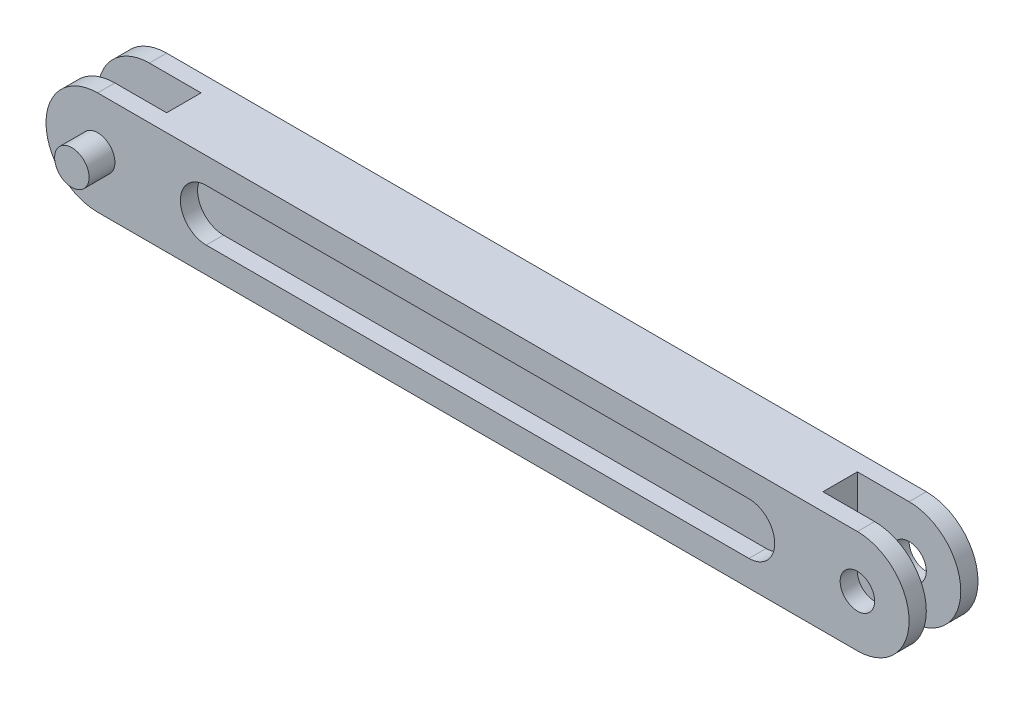
ISO-10303-21;
HEADER;
FILE_DESCRIPTION(('STEP AP214'),'2;1');
FILE_NAME('part.step','',(''),(''),'','','');
FILE_SCHEMA(('AUTOMOTIVE_DESIGN { 1 0 10303 214 1 1 1 1 }'));
ENDSEC;
DATA;
#1=APPLICATION_CONTEXT('core data for automotive mechanical design processes');
#2=APPLICATION_PROTOCOL_DEFINITION('international standard','automotive_design',2000,#1);
#3=PRODUCT_CONTEXT('',#1,'mechanical');
#4=PRODUCT('Part','Part','',(#3));
#5=PRODUCT_RELATED_PRODUCT_CATEGORY('part','',(#4));
#6=PRODUCT_DEFINITION_FORMATION('','',#4);
#7=PRODUCT_DEFINITION_CONTEXT('part definition',#1,'design');
#8=PRODUCT_DEFINITION('design','',#6,#7);
#9=PRODUCT_DEFINITION_SHAPE('','',#8);
#10=(LENGTH_UNIT() NAMED_UNIT(*) SI_UNIT(.MILLI.,.METRE.));
#11=(NAMED_UNIT(*) PLANE_ANGLE_UNIT() SI_UNIT($,.RADIAN.));
#12=(NAMED_UNIT(*) SI_UNIT($,.STERADIAN.) SOLID_ANGLE_UNIT());
#13=UNCERTAINTY_MEASURE_WITH_UNIT(LENGTH_MEASURE(1.E-05),#10,'distance_accuracy_value','');
#14=(GEOMETRIC_REPRESENTATION_CONTEXT(3) GLOBAL_UNCERTAINTY_ASSIGNED_CONTEXT((#13)) GLOBAL_UNIT_ASSIGNED_CONTEXT((#10,
#11,#12)) REPRESENTATION_CONTEXT('',''));
#15=CARTESIAN_POINT('',(0.,0.,0.));
#16=DIRECTION('',(0.,0.,1.));
#17=DIRECTION('',(1.,0.,0.));
#18=AXIS2_PLACEMENT_3D('',#15,#16,#17);
#19=CARTESIAN_POINT('',(0.,-19.05,25.4));
#20=DIRECTION('',(0.,1.,0.));
#21=DIRECTION('',(0.,0.,1.));
#22=AXIS2_PLACEMENT_3D('',#19,#20,#21);
#23=PLANE('',#22);
#24=DIRECTION('',(1.,0.,0.));
#25=VECTOR('',#24,1.);
#26=CARTESIAN_POINT('',(260.95,-19.05,19.05));
#27=LINE('',#26,#25);
#28=CARTESIAN_POINT('',(260.95,-19.05,19.05));
#29=VERTEX_POINT('',#28);
#30=CARTESIAN_POINT('',(280.,-19.05,19.05));
#31=VERTEX_POINT('',#30);
#32=EDGE_CURVE('E329',#29,#31,#27,.T.);
#33=ORIENTED_EDGE('',*,*,#32,.T.);
#34=DIRECTION('',(0.,0.,-1.));
#35=VECTOR('',#34,1.);
#36=CARTESIAN_POINT('',(280.,-19.05,25.4));
#37=LINE('',#36,#35);
#38=CARTESIAN_POINT('',(280.,-19.05,25.4));
#39=VERTEX_POINT('',#38);
#40=EDGE_CURVE('E326',#39,#31,#37,.T.);
#41=ORIENTED_EDGE('',*,*,#40,.F.);
#42=DIRECTION('',(1.,0.,0.));
#43=VECTOR('',#42,1.);
#44=CARTESIAN_POINT('',(0.,-19.05,25.4));
#45=LINE('',#44,#43);
#46=CARTESIAN_POINT('',(0.,-19.05,25.4));
#47=VERTEX_POINT('',#46);
#48=EDGE_CURVE('E302',#47,#39,#45,.T.);
#49=ORIENTED_EDGE('',*,*,#48,.F.);
#50=DIRECTION('',(0.,0.,-1.));
#51=VECTOR('',#50,1.);
#52=CARTESIAN_POINT('',(0.,-19.05,25.4));
#53=LINE('',#52,#51);
#54=CARTESIAN_POINT('',(0.,-19.05,19.05));
#55=VERTEX_POINT('',#54);
#56=EDGE_CURVE('E11',#47,#55,#53,.T.);
#57=ORIENTED_EDGE('',*,*,#56,.T.);
#58=DIRECTION('',(-1.,0.,0.));
#59=VECTOR('',#58,1.);
#60=CARTESIAN_POINT('',(19.05,-19.05,19.05));
#61=LINE('',#60,#59);
#62=CARTESIAN_POINT('',(19.05,-19.05,19.05));
#63=VERTEX_POINT('',#62);
#64=EDGE_CURVE('E210',#63,#55,#61,.T.);
#65=ORIENTED_EDGE('',*,*,#64,.F.);
#66=DIRECTION('',(0.,0.,1.));
#67=VECTOR('',#66,1.);
#68=CARTESIAN_POINT('',(19.05,-19.05,6.35));
#69=LINE('',#68,#67);
#70=CARTESIAN_POINT('',(19.05,-19.05,6.35));
#71=VERTEX_POINT('',#70);
#72=EDGE_CURVE('E202',#71,#63,#69,.T.);
#73=ORIENTED_EDGE('',*,*,#72,.F.);
#74=DIRECTION('',(-1.,0.,0.));
#75=VECTOR('',#74,1.);
#76=CARTESIAN_POINT('',(19.05,-19.05,6.35));
#77=LINE('',#76,#75);
#78=CARTESIAN_POINT('',(0.,-19.05,6.35));
#79=VERTEX_POINT('',#78);
#80=EDGE_CURVE('E211',#71,#79,#77,.T.);
#81=ORIENTED_EDGE('',*,*,#80,.T.);
#82=CARTESIAN_POINT('',(0.,-19.05,0.));
#83=VERTEX_POINT('',#82);
#84=EDGE_CURVE('E41',#79,#83,#53,.T.);
#85=ORIENTED_EDGE('',*,*,#84,.T.);
#86=DIRECTION('',(1.,0.,0.));
#87=VECTOR('',#86,1.);
#88=CARTESIAN_POINT('',(0.,-19.05,0.));
#89=LINE('',#88,#87);
#90=CARTESIAN_POINT('',(280.,-19.05,0.));
#91=VERTEX_POINT('',#90);
#92=EDGE_CURVE('E312',#83,#91,#89,.T.);
#93=ORIENTED_EDGE('',*,*,#92,.T.);
#94=CARTESIAN_POINT('',(280.,-19.05,6.35));
#95=VERTEX_POINT('',#94);
#96=EDGE_CURVE('E190',#95,#91,#37,.T.);
#97=ORIENTED_EDGE('',*,*,#96,.F.);
#98=DIRECTION('',(1.,0.,0.));
#99=VECTOR('',#98,1.);
#100=CARTESIAN_POINT('',(260.95,-19.05,6.35));
#101=LINE('',#100,#99);
#102=CARTESIAN_POINT('',(260.95,-19.05,6.35));
#103=VERTEX_POINT('',#102);
#104=EDGE_CURVE('E172',#103,#95,#101,.T.);
#105=ORIENTED_EDGE('',*,*,#104,.F.);
#106=DIRECTION('',(0.,0.,1.));
#107=VECTOR('',#106,1.);
#108=CARTESIAN_POINT('',(260.95,-19.05,6.35));
#109=LINE('',#108,#107);
#110=EDGE_CURVE('E178',#103,#29,#109,.T.);
#111=ORIENTED_EDGE('',*,*,#110,.T.);
#112=EDGE_LOOP('',(#33,#41,#49,#57,#65,#73,#81,#85,#93,#97,#105,#111));
#113=FACE_BOUND('',#112,.T.);
#114=ADVANCED_FACE('F32',(#113),#23,.F.);
#115=CARTESIAN_POINT('',(280.,0.,25.4));
#116=DIRECTION('',(0.,0.,-1.));
#117=DIRECTION('',(-1.,0.,0.));
#118=AXIS2_PLACEMENT_3D('',#115,#116,#117);
#119=CYLINDRICAL_SURFACE('',#118,19.05);
#120=CARTESIAN_POINT('',(280.,0.,19.05));
#121=DIRECTION('',(0.,0.,-1.));
#122=DIRECTION('',(-1.,0.,0.));
#123=AXIS2_PLACEMENT_3D('',#120,#121,#122);
#124=CIRCLE('',#123,19.05);
#125=CARTESIAN_POINT('',(280.,19.05,19.05));
#126=VERTEX_POINT('',#125);
#127=EDGE_CURVE('E200',#126,#31,#124,.T.);
#128=ORIENTED_EDGE('',*,*,#127,.F.);
#129=DIRECTION('',(0.,0.,-1.));
#130=VECTOR('',#129,1.);
#131=CARTESIAN_POINT('',(280.,19.05,25.4));
#132=LINE('',#131,#130);
#133=CARTESIAN_POINT('',(280.,19.05,25.4));
#134=VERTEX_POINT('',#133);
#135=EDGE_CURVE('E323',#134,#126,#132,.T.);
#136=ORIENTED_EDGE('',*,*,#135,.F.);
#137=CARTESIAN_POINT('',(280.,0.,25.4));
#138=DIRECTION('',(0.,0.,1.));
#139=DIRECTION('',(1.,0.,0.));
#140=AXIS2_PLACEMENT_3D('',#137,#138,#139);
#141=CIRCLE('',#140,19.05);
#142=EDGE_CURVE('E305',#39,#134,#141,.T.);
#143=ORIENTED_EDGE('',*,*,#142,.F.);
#144=ORIENTED_EDGE('',*,*,#40,.T.);
#145=EDGE_LOOP('',(#128,#136,#143,#144));
#146=FACE_BOUND('',#145,.T.);
#147=ADVANCED_FACE('F371',(#146),#119,.T.);
#148=CARTESIAN_POINT('',(280.,0.,6.35));
#149=DIRECTION('',(0.,0.,1.));
#150=DIRECTION('',(0.,-1.,0.));
#151=AXIS2_PLACEMENT_3D('',#148,#149,#150);
#152=CIRCLE('',#151,19.05);
#153=CARTESIAN_POINT('',(280.,19.05,6.35));
#154=VERTEX_POINT('',#153);
#155=EDGE_CURVE('E197',#95,#154,#152,.T.);
#156=ORIENTED_EDGE('',*,*,#155,.F.);
#157=ORIENTED_EDGE('',*,*,#96,.T.);
#158=CARTESIAN_POINT('',(280.,0.,0.));
#159=DIRECTION('',(0.,0.,1.));
#160=DIRECTION('',(1.,0.,0.));
#161=AXIS2_PLACEMENT_3D('',#158,#159,#160);
#162=CIRCLE('',#161,19.05);
#163=CARTESIAN_POINT('',(280.,19.05,0.));
#164=VERTEX_POINT('',#163);
#165=EDGE_CURVE('E314',#91,#164,#162,.T.);
#166=ORIENTED_EDGE('',*,*,#165,.T.);
#167=EDGE_CURVE('E322',#154,#164,#132,.T.);
#168=ORIENTED_EDGE('',*,*,#167,.F.);
#169=EDGE_LOOP('',(#156,#157,#166,#168));
#170=FACE_BOUND('',#169,.T.);
#171=ADVANCED_FACE('F375',(#170),#119,.T.);
#172=CARTESIAN_POINT('',(0.,19.05,25.4));
#173=DIRECTION('',(0.,-1.,0.));
#174=DIRECTION('',(0.,0.,-1.));
#175=AXIS2_PLACEMENT_3D('',#172,#173,#174);
#176=PLANE('',#175);
#177=DIRECTION('',(1.,0.,0.));
#178=VECTOR('',#177,1.);
#179=CARTESIAN_POINT('',(260.95,19.05,19.05));
#180=LINE('',#179,#178);
#181=CARTESIAN_POINT('',(260.95,19.05,19.05));
#182=VERTEX_POINT('',#181);
#183=EDGE_CURVE('E192',#182,#126,#180,.T.);
#184=ORIENTED_EDGE('',*,*,#183,.F.);
#185=DIRECTION('',(0.,0.,-1.));
#186=VECTOR('',#185,1.);
#187=CARTESIAN_POINT('',(260.95,19.05,6.35));
#188=LINE('',#187,#186);
#189=CARTESIAN_POINT('',(260.95,19.05,6.35));
#190=VERTEX_POINT('',#189);
#191=EDGE_CURVE('E177',#182,#190,#188,.T.);
#192=ORIENTED_EDGE('',*,*,#191,.T.);
#193=DIRECTION('',(1.,0.,0.));
#194=VECTOR('',#193,1.);
#195=CARTESIAN_POINT('',(260.95,19.05,6.35));
#196=LINE('',#195,#194);
#197=EDGE_CURVE('E175',#190,#154,#196,.T.);
#198=ORIENTED_EDGE('',*,*,#197,.T.);
#199=ORIENTED_EDGE('',*,*,#167,.T.);
#200=DIRECTION('',(-1.,0.,0.));
#201=VECTOR('',#200,1.);
#202=CARTESIAN_POINT('',(0.,19.05,0.));
#203=LINE('',#202,#201);
#204=CARTESIAN_POINT('',(0.,19.05,0.));
#205=VERTEX_POINT('',#204);
#206=EDGE_CURVE('E303',#164,#205,#203,.T.);
#207=ORIENTED_EDGE('',*,*,#206,.T.);
#208=DIRECTION('',(0.,0.,-1.));
#209=VECTOR('',#208,1.);
#210=CARTESIAN_POINT('',(0.,19.05,25.4));
#211=LINE('',#210,#209);
#212=CARTESIAN_POINT('',(0.,19.05,6.35));
#213=VERTEX_POINT('',#212);
#214=EDGE_CURVE('E309',#213,#205,#211,.T.);
#215=ORIENTED_EDGE('',*,*,#214,.F.);
#216=DIRECTION('',(-1.,0.,0.));
#217=VECTOR('',#216,1.);
#218=CARTESIAN_POINT('',(19.05,19.05,6.35));
#219=LINE('',#218,#217);
#220=CARTESIAN_POINT('',(19.05,19.05,6.35));
#221=VERTEX_POINT('',#220);
#222=EDGE_CURVE('E215',#221,#213,#219,.T.);
#223=ORIENTED_EDGE('',*,*,#222,.F.);
#224=DIRECTION('',(0.,0.,-1.));
#225=VECTOR('',#224,1.);
#226=CARTESIAN_POINT('',(19.05,19.05,6.35));
#227=LINE('',#226,#225);
#228=CARTESIAN_POINT('',(19.05,19.05,19.05));
#229=VERTEX_POINT('',#228);
#230=EDGE_CURVE('E205',#229,#221,#227,.T.);
#231=ORIENTED_EDGE('',*,*,#230,.F.);
#232=DIRECTION('',(-1.,0.,0.));
#233=VECTOR('',#232,1.);
#234=CARTESIAN_POINT('',(19.05,19.05,19.05));
#235=LINE('',#234,#233);
#236=CARTESIAN_POINT('',(0.,19.05,19.05));
#237=VERTEX_POINT('',#236);
#238=EDGE_CURVE('E218',#229,#237,#235,.T.);
#239=ORIENTED_EDGE('',*,*,#238,.T.);
#240=CARTESIAN_POINT('',(0.,19.05,25.4));
#241=VERTEX_POINT('',#240);
#242=EDGE_CURVE('E319',#241,#237,#211,.T.);
#243=ORIENTED_EDGE('',*,*,#242,.F.);
#244=DIRECTION('',(-1.,0.,0.));
#245=VECTOR('',#244,1.);
#246=CARTESIAN_POINT('',(0.,19.05,25.4));
#247=LINE('',#246,#245);
#248=EDGE_CURVE('E307',#134,#241,#247,.T.);
#249=ORIENTED_EDGE('',*,*,#248,.F.);
#250=ORIENTED_EDGE('',*,*,#135,.T.);
#251=EDGE_LOOP('',(#184,#192,#198,#199,#207,#215,#223,#231,#239,#243,#249,#250));
#252=FACE_BOUND('',#251,.T.);
#253=ADVANCED_FACE('F379',(#252),#176,.F.);
#254=CARTESIAN_POINT('',(280.,0.,25.4));
#255=DIRECTION('',(0.,0.,-1.));
#256=DIRECTION('',(-1.,0.,0.));
#257=AXIS2_PLACEMENT_3D('',#254,#255,#256);
#258=CYLINDRICAL_SURFACE('',#257,6.35);
#259=CARTESIAN_POINT('',(280.,0.,25.4));
#260=DIRECTION('',(0.,0.,1.));
#261=DIRECTION('',(1.,0.,0.));
#262=AXIS2_PLACEMENT_3D('',#259,#260,#261);
#263=CIRCLE('',#262,6.35);
#264=CARTESIAN_POINT('',(286.35,0.,25.4));
#265=VERTEX_POINT('',#264);
#266=EDGE_CURVE('E290',#265,#265,#263,.T.);
#267=ORIENTED_EDGE('',*,*,#266,.T.);
#268=EDGE_LOOP('',(#267));
#269=FACE_BOUND('',#268,.T.);
#270=CARTESIAN_POINT('',(280.,0.,19.05));
#271=DIRECTION('',(0.,0.,-1.));
#272=DIRECTION('',(-1.,0.,0.));
#273=AXIS2_PLACEMENT_3D('',#270,#271,#272);
#274=CIRCLE('',#273,6.35);
#275=CARTESIAN_POINT('',(273.65,0.,19.05));
#276=VERTEX_POINT('',#275);
#277=EDGE_CURVE('E36',#276,#276,#274,.T.);
#278=ORIENTED_EDGE('',*,*,#277,.T.);
#279=EDGE_LOOP('',(#278));
#280=FACE_BOUND('',#279,.T.);
#281=ADVANCED_FACE('F382',(#269,#280),#258,.F.);
#282=CARTESIAN_POINT('',(280.,0.,0.));
#283=DIRECTION('',(0.,0.,1.));
#284=DIRECTION('',(1.,0.,0.));
#285=AXIS2_PLACEMENT_3D('',#282,#283,#284);
#286=CIRCLE('',#285,6.35);
#287=CARTESIAN_POINT('',(286.35,0.,0.));
#288=VERTEX_POINT('',#287);
#289=EDGE_CURVE('E283',#288,#288,#286,.T.);
#290=ORIENTED_EDGE('',*,*,#289,.F.);
#291=EDGE_LOOP('',(#290));
#292=FACE_BOUND('',#291,.T.);
#293=CARTESIAN_POINT('',(280.,0.,6.35));
#294=DIRECTION('',(0.,0.,1.));
#295=DIRECTION('',(0.,-1.,0.));
#296=AXIS2_PLACEMENT_3D('',#293,#294,#295);
#297=CIRCLE('',#296,6.35);
#298=CARTESIAN_POINT('',(280.,-6.35,6.35));
#299=VERTEX_POINT('',#298);
#300=EDGE_CURVE('E199',#299,#299,#297,.T.);
#301=ORIENTED_EDGE('',*,*,#300,.T.);
#302=EDGE_LOOP('',(#301));
#303=FACE_BOUND('',#302,.T.);
#304=ADVANCED_FACE('F395',(#292,#303),#258,.F.);
#305=CARTESIAN_POINT('',(0.,0.,25.4));
#306=DIRECTION('',(0.,0.,-1.));
#307=DIRECTION('',(-1.,0.,0.));
#308=AXIS2_PLACEMENT_3D('',#305,#306,#307);
#309=CYLINDRICAL_SURFACE('',#308,19.05);
#310=ORIENTED_EDGE('',*,*,#242,.T.);
#311=CARTESIAN_POINT('',(0.,0.,19.05));
#312=DIRECTION('',(0.,0.,1.));
#313=DIRECTION('',(1.,0.,0.));
#314=AXIS2_PLACEMENT_3D('',#311,#312,#313);
#315=CIRCLE('',#314,19.05);
#316=EDGE_CURVE('E214',#237,#55,#315,.T.);
#317=ORIENTED_EDGE('',*,*,#316,.T.);
#318=ORIENTED_EDGE('',*,*,#56,.F.);
#319=CARTESIAN_POINT('',(0.,0.,25.4));
#320=DIRECTION('',(0.,0.,1.));
#321=DIRECTION('',(1.,0.,0.));
#322=AXIS2_PLACEMENT_3D('',#319,#320,#321);
#323=CIRCLE('',#322,19.05);
#324=EDGE_CURVE('E299',#241,#47,#323,.T.);
#325=ORIENTED_EDGE('',*,*,#324,.F.);
#326=EDGE_LOOP('',(#310,#317,#318,#325));
#327=FACE_BOUND('',#326,.T.);
#328=ADVANCED_FACE('F388',(#327),#309,.T.);
#329=CARTESIAN_POINT('',(0.,0.,0.));
#330=DIRECTION('',(0.,0.,1.));
#331=DIRECTION('',(1.,0.,0.));
#332=AXIS2_PLACEMENT_3D('',#329,#330,#331);
#333=PLANE('',#332);
#334=ORIENTED_EDGE('',*,*,#289,.T.);
#335=EDGE_LOOP('',(#334));
#336=FACE_BOUND('',#335,.T.);
#337=CARTESIAN_POINT('',(0.,0.,0.));
#338=DIRECTION('',(0.,0.,1.));
#339=DIRECTION('',(1.,0.,0.));
#340=AXIS2_PLACEMENT_3D('',#337,#338,#339);
#341=CIRCLE('',#340,6.35);
#342=CARTESIAN_POINT('',(6.35,0.,0.));
#343=VERTEX_POINT('',#342);
#344=EDGE_CURVE('E186',#343,#343,#341,.T.);
#345=ORIENTED_EDGE('',*,*,#344,.T.);
#346=EDGE_LOOP('',(#345));
#347=FACE_BOUND('',#346,.T.);
#348=CARTESIAN_POINT('',(0.,0.,0.));
#349=DIRECTION('',(0.,0.,1.));
#350=DIRECTION('',(1.,0.,0.));
#351=AXIS2_PLACEMENT_3D('',#348,#349,#350);
#352=CIRCLE('',#351,19.05);
#353=EDGE_CURVE('E298',#205,#83,#352,.T.);
#354=ORIENTED_EDGE('',*,*,#353,.F.);
#355=ORIENTED_EDGE('',*,*,#206,.F.);
#356=ORIENTED_EDGE('',*,*,#165,.F.);
#357=ORIENTED_EDGE('',*,*,#92,.F.);
#358=EDGE_LOOP('',(#354,#355,#356,#357));
#359=FACE_BOUND('',#358,.T.);
#360=CARTESIAN_POINT('',(40.,0.,0.));
#361=DIRECTION('',(0.,0.,1.));
#362=DIRECTION('',(1.,0.,0.));
#363=AXIS2_PLACEMENT_3D('',#360,#361,#362);
#364=CIRCLE('',#363,9.525);
#365=CARTESIAN_POINT('',(40.,9.525,0.));
#366=VERTEX_POINT('',#365);
#367=CARTESIAN_POINT('',(40.,-9.525,0.));
#368=VERTEX_POINT('',#367);
#369=EDGE_CURVE('E226',#366,#368,#364,.T.);
#370=ORIENTED_EDGE('',*,*,#369,.T.);
#371=DIRECTION('',(1.,0.,0.));
#372=VECTOR('',#371,1.);
#373=CARTESIAN_POINT('',(40.,-9.525,0.));
#374=LINE('',#373,#372);
#375=CARTESIAN_POINT('',(240.,-9.525,0.));
#376=VERTEX_POINT('',#375);
#377=EDGE_CURVE('E231',#368,#376,#374,.T.);
#378=ORIENTED_EDGE('',*,*,#377,.T.);
#379=CARTESIAN_POINT('',(240.,0.,0.));
#380=DIRECTION('',(0.,0.,1.));
#381=DIRECTION('',(1.,0.,0.));
#382=AXIS2_PLACEMENT_3D('',#379,#380,#381);
#383=CIRCLE('',#382,9.525);
#384=CARTESIAN_POINT('',(240.,9.525,0.));
#385=VERTEX_POINT('',#384);
#386=EDGE_CURVE('E243',#376,#385,#383,.T.);
#387=ORIENTED_EDGE('',*,*,#386,.T.);
#388=DIRECTION('',(-1.,0.,0.));
#389=VECTOR('',#388,1.);
#390=CARTESIAN_POINT('',(40.,9.525,0.));
#391=LINE('',#390,#389);
#392=EDGE_CURVE('E240',#385,#366,#391,.T.);
#393=ORIENTED_EDGE('',*,*,#392,.T.);
#394=EDGE_LOOP('',(#370,#378,#387,#393));
#395=FACE_BOUND('',#394,.T.);
#396=ADVANCED_FACE('F384',(#336,#347,#359,#395),#333,.F.);
#397=CARTESIAN_POINT('',(0.,0.,25.4));
#398=DIRECTION('',(0.,0.,1.));
#399=DIRECTION('',(1.,0.,0.));
#400=AXIS2_PLACEMENT_3D('',#397,#398,#399);
#401=PLANE('',#400);
#402=CARTESIAN_POINT('',(40.,0.,25.4));
#403=DIRECTION('',(0.,0.,1.));
#404=DIRECTION('',(1.,0.,0.));
#405=AXIS2_PLACEMENT_3D('',#402,#403,#404);
#406=CIRCLE('',#405,9.525);
#407=CARTESIAN_POINT('',(40.,9.525,25.4));
#408=VERTEX_POINT('',#407);
#409=CARTESIAN_POINT('',(40.,-9.525,25.4));
#410=VERTEX_POINT('',#409);
#411=EDGE_CURVE('E251',#408,#410,#406,.T.);
#412=ORIENTED_EDGE('',*,*,#411,.F.);
#413=DIRECTION('',(-1.,0.,0.));
#414=VECTOR('',#413,1.);
#415=CARTESIAN_POINT('',(40.,9.525,25.4));
#416=LINE('',#415,#414);
#417=CARTESIAN_POINT('',(240.,9.525,25.4));
#418=VERTEX_POINT('',#417);
#419=EDGE_CURVE('E262',#418,#408,#416,.T.);
#420=ORIENTED_EDGE('',*,*,#419,.F.);
#421=CARTESIAN_POINT('',(240.,0.,25.4));
#422=DIRECTION('',(0.,0.,1.));
#423=DIRECTION('',(1.,0.,0.));
#424=AXIS2_PLACEMENT_3D('',#421,#422,#423);
#425=CIRCLE('',#424,9.525);
#426=CARTESIAN_POINT('',(240.,-9.525,25.4));
#427=VERTEX_POINT('',#426);
#428=EDGE_CURVE('E276',#427,#418,#425,.T.);
#429=ORIENTED_EDGE('',*,*,#428,.F.);
#430=DIRECTION('',(1.,0.,0.));
#431=VECTOR('',#430,1.);
#432=CARTESIAN_POINT('',(40.,-9.525,25.4));
#433=LINE('',#432,#431);
#434=EDGE_CURVE('E273',#410,#427,#433,.T.);
#435=ORIENTED_EDGE('',*,*,#434,.F.);
#436=EDGE_LOOP('',(#412,#420,#429,#435));
#437=FACE_BOUND('',#436,.T.);
#438=CARTESIAN_POINT('',(0.,0.,25.4));
#439=DIRECTION('',(0.,0.,1.));
#440=DIRECTION('',(1.,0.,0.));
#441=AXIS2_PLACEMENT_3D('',#438,#439,#440);
#442=CIRCLE('',#441,6.35);
#443=CARTESIAN_POINT('',(6.35,0.,25.4));
#444=VERTEX_POINT('',#443);
#445=EDGE_CURVE('E293',#444,#444,#442,.T.);
#446=ORIENTED_EDGE('',*,*,#445,.F.);
#447=EDGE_LOOP('',(#446));
#448=FACE_BOUND('',#447,.T.);
#449=ORIENTED_EDGE('',*,*,#324,.T.);
#450=ORIENTED_EDGE('',*,*,#48,.T.);
#451=ORIENTED_EDGE('',*,*,#142,.T.);
#452=ORIENTED_EDGE('',*,*,#248,.T.);
#453=EDGE_LOOP('',(#449,#450,#451,#452));
#454=FACE_BOUND('',#453,.T.);
#455=ORIENTED_EDGE('',*,*,#266,.F.);
#456=EDGE_LOOP('',(#455));
#457=FACE_BOUND('',#456,.T.);
#458=ADVANCED_FACE('F387',(#437,#448,#454,#457),#401,.T.);
#459=ORIENTED_EDGE('',*,*,#84,.F.);
#460=CARTESIAN_POINT('',(0.,0.,6.35));
#461=DIRECTION('',(0.,0.,-1.));
#462=DIRECTION('',(0.,1.,0.));
#463=AXIS2_PLACEMENT_3D('',#460,#461,#462);
#464=CIRCLE('',#463,19.05);
#465=EDGE_CURVE('E224',#79,#213,#464,.T.);
#466=ORIENTED_EDGE('',*,*,#465,.T.);
#467=ORIENTED_EDGE('',*,*,#214,.T.);
#468=ORIENTED_EDGE('',*,*,#353,.T.);
#469=EDGE_LOOP('',(#459,#466,#467,#468));
#470=FACE_BOUND('',#469,.T.);
#471=ADVANCED_FACE('F34',(#470),#309,.T.);
#472=CARTESIAN_POINT('',(40.,0.,19.05));
#473=DIRECTION('',(0.,0.,1.));
#474=DIRECTION('',(1.,0.,0.));
#475=AXIS2_PLACEMENT_3D('',#472,#473,#474);
#476=CYLINDRICAL_SURFACE('',#475,9.525);
#477=ORIENTED_EDGE('',*,*,#411,.T.);
#478=DIRECTION('',(0.,0.,1.));
#479=VECTOR('',#478,1.);
#480=CARTESIAN_POINT('',(40.,-9.525,19.05));
#481=LINE('',#480,#479);
#482=CARTESIAN_POINT('',(40.,-9.525,19.05));
#483=VERTEX_POINT('',#482);
#484=EDGE_CURVE('E271',#483,#410,#481,.T.);
#485=ORIENTED_EDGE('',*,*,#484,.F.);
#486=CARTESIAN_POINT('',(40.,0.,19.05));
#487=DIRECTION('',(0.,0.,1.));
#488=DIRECTION('',(1.,0.,0.));
#489=AXIS2_PLACEMENT_3D('',#486,#487,#488);
#490=CIRCLE('',#489,9.525);
#491=CARTESIAN_POINT('',(40.,9.525,19.05));
#492=VERTEX_POINT('',#491);
#493=EDGE_CURVE('E258',#492,#483,#490,.T.);
#494=ORIENTED_EDGE('',*,*,#493,.F.);
#495=DIRECTION('',(0.,0.,1.));
#496=VECTOR('',#495,1.);
#497=CARTESIAN_POINT('',(40.,9.525,19.05));
#498=LINE('',#497,#496);
#499=EDGE_CURVE('E281',#492,#408,#498,.T.);
#500=ORIENTED_EDGE('',*,*,#499,.T.);
#501=EDGE_LOOP('',(#477,#485,#494,#500));
#502=FACE_BOUND('',#501,.T.);
#503=ADVANCED_FACE('F397',(#502),#476,.F.);
#504=CARTESIAN_POINT('',(40.,9.525,19.05));
#505=DIRECTION('',(0.,1.,0.));
#506=DIRECTION('',(0.,0.,1.));
#507=AXIS2_PLACEMENT_3D('',#504,#505,#506);
#508=PLANE('',#507);
#509=ORIENTED_EDGE('',*,*,#419,.T.);
#510=ORIENTED_EDGE('',*,*,#499,.F.);
#511=DIRECTION('',(-1.,0.,0.));
#512=VECTOR('',#511,1.);
#513=CARTESIAN_POINT('',(40.,9.525,19.05));
#514=LINE('',#513,#512);
#515=CARTESIAN_POINT('',(240.,9.525,19.05));
#516=VERTEX_POINT('',#515);
#517=EDGE_CURVE('E268',#516,#492,#514,.T.);
#518=ORIENTED_EDGE('',*,*,#517,.F.);
#519=DIRECTION('',(0.,0.,1.));
#520=VECTOR('',#519,1.);
#521=CARTESIAN_POINT('',(240.,9.525,19.05));
#522=LINE('',#521,#520);
#523=EDGE_CURVE('E284',#516,#418,#522,.T.);
#524=ORIENTED_EDGE('',*,*,#523,.T.);
#525=EDGE_LOOP('',(#509,#510,#518,#524));
#526=FACE_BOUND('',#525,.T.);
#527=ADVANCED_FACE('F400',(#526),#508,.F.);
#528=CARTESIAN_POINT('',(240.,0.,19.05));
#529=DIRECTION('',(0.,0.,1.));
#530=DIRECTION('',(1.,0.,0.));
#531=AXIS2_PLACEMENT_3D('',#528,#529,#530);
#532=CYLINDRICAL_SURFACE('',#531,9.525);
#533=ORIENTED_EDGE('',*,*,#428,.T.);
#534=ORIENTED_EDGE('',*,*,#523,.F.);
#535=CARTESIAN_POINT('',(240.,0.,19.05));
#536=DIRECTION('',(0.,0.,1.));
#537=DIRECTION('',(1.,0.,0.));
#538=AXIS2_PLACEMENT_3D('',#535,#536,#537);
#539=CIRCLE('',#538,9.525);
#540=CARTESIAN_POINT('',(240.,-9.525,19.05));
#541=VERTEX_POINT('',#540);
#542=EDGE_CURVE('E265',#541,#516,#539,.T.);
#543=ORIENTED_EDGE('',*,*,#542,.F.);
#544=DIRECTION('',(0.,0.,1.));
#545=VECTOR('',#544,1.);
#546=CARTESIAN_POINT('',(240.,-9.525,19.05));
#547=LINE('',#546,#545);
#548=EDGE_CURVE('E286',#541,#427,#547,.T.);
#549=ORIENTED_EDGE('',*,*,#548,.T.);
#550=EDGE_LOOP('',(#533,#534,#543,#549));
#551=FACE_BOUND('',#550,.T.);
#552=ADVANCED_FACE('F406',(#551),#532,.F.);
#553=CARTESIAN_POINT('',(40.,-9.525,19.05));
#554=DIRECTION('',(0.,-1.,0.));
#555=DIRECTION('',(0.,0.,-1.));
#556=AXIS2_PLACEMENT_3D('',#553,#554,#555);
#557=PLANE('',#556);
#558=ORIENTED_EDGE('',*,*,#434,.T.);
#559=ORIENTED_EDGE('',*,*,#548,.F.);
#560=DIRECTION('',(1.,0.,0.));
#561=VECTOR('',#560,1.);
#562=CARTESIAN_POINT('',(40.,-9.525,19.05));
#563=LINE('',#562,#561);
#564=EDGE_CURVE('E261',#483,#541,#563,.T.);
#565=ORIENTED_EDGE('',*,*,#564,.F.);
#566=ORIENTED_EDGE('',*,*,#484,.T.);
#567=EDGE_LOOP('',(#558,#559,#565,#566));
#568=FACE_BOUND('',#567,.T.);
#569=ADVANCED_FACE('F402',(#568),#557,.F.);
#570=CARTESIAN_POINT('',(40.,0.,19.05));
#571=DIRECTION('',(0.,0.,1.));
#572=DIRECTION('',(1.,0.,0.));
#573=AXIS2_PLACEMENT_3D('',#570,#571,#572);
#574=PLANE('',#573);
#575=ORIENTED_EDGE('',*,*,#493,.T.);
#576=ORIENTED_EDGE('',*,*,#564,.T.);
#577=ORIENTED_EDGE('',*,*,#542,.T.);
#578=ORIENTED_EDGE('',*,*,#517,.T.);
#579=EDGE_LOOP('',(#575,#576,#577,#578));
#580=FACE_BOUND('',#579,.T.);
#581=ADVANCED_FACE('F405',(#580),#574,.T.);
#582=CARTESIAN_POINT('',(40.,0.,6.35));
#583=DIRECTION('',(0.,0.,-1.));
#584=DIRECTION('',(-1.,0.,0.));
#585=AXIS2_PLACEMENT_3D('',#582,#583,#584);
#586=CYLINDRICAL_SURFACE('',#585,9.525);
#587=ORIENTED_EDGE('',*,*,#369,.F.);
#588=DIRECTION('',(0.,0.,-1.));
#589=VECTOR('',#588,1.);
#590=CARTESIAN_POINT('',(40.,9.525,6.35));
#591=LINE('',#590,#589);
#592=CARTESIAN_POINT('',(40.,9.525,6.35));
#593=VERTEX_POINT('',#592);
#594=EDGE_CURVE('E237',#593,#366,#591,.T.);
#595=ORIENTED_EDGE('',*,*,#594,.F.);
#596=CARTESIAN_POINT('',(40.,0.,6.35));
#597=DIRECTION('',(0.,0.,1.));
#598=DIRECTION('',(1.,0.,0.));
#599=AXIS2_PLACEMENT_3D('',#596,#597,#598);
#600=CIRCLE('',#599,9.525);
#601=CARTESIAN_POINT('',(40.,-9.525,6.35));
#602=VERTEX_POINT('',#601);
#603=EDGE_CURVE('E227',#593,#602,#600,.T.);
#604=ORIENTED_EDGE('',*,*,#603,.T.);
#605=DIRECTION('',(0.,0.,-1.));
#606=VECTOR('',#605,1.);
#607=CARTESIAN_POINT('',(40.,-9.525,6.35));
#608=LINE('',#607,#606);
#609=EDGE_CURVE('E248',#602,#368,#608,.T.);
#610=ORIENTED_EDGE('',*,*,#609,.T.);
#611=EDGE_LOOP('',(#587,#595,#604,#610));
#612=FACE_BOUND('',#611,.T.);
#613=ADVANCED_FACE('F416',(#612),#586,.F.);
#614=CARTESIAN_POINT('',(40.,-9.525,6.35));
#615=DIRECTION('',(0.,1.,0.));
#616=DIRECTION('',(0.,0.,1.));
#617=AXIS2_PLACEMENT_3D('',#614,#615,#616);
#618=PLANE('',#617);
#619=ORIENTED_EDGE('',*,*,#377,.F.);
#620=ORIENTED_EDGE('',*,*,#609,.F.);
#621=DIRECTION('',(1.,0.,0.));
#622=VECTOR('',#621,1.);
#623=CARTESIAN_POINT('',(40.,-9.525,6.35));
#624=LINE('',#623,#622);
#625=CARTESIAN_POINT('',(240.,-9.525,6.35));
#626=VERTEX_POINT('',#625);
#627=EDGE_CURVE('E235',#602,#626,#624,.T.);
#628=ORIENTED_EDGE('',*,*,#627,.T.);
#629=DIRECTION('',(0.,0.,-1.));
#630=VECTOR('',#629,1.);
#631=CARTESIAN_POINT('',(240.,-9.525,6.35));
#632=LINE('',#631,#630);
#633=EDGE_CURVE('E252',#626,#376,#632,.T.);
#634=ORIENTED_EDGE('',*,*,#633,.T.);
#635=EDGE_LOOP('',(#619,#620,#628,#634));
#636=FACE_BOUND('',#635,.T.);
#637=ADVANCED_FACE('F420',(#636),#618,.T.);
#638=CARTESIAN_POINT('',(240.,0.,6.35));
#639=DIRECTION('',(0.,0.,-1.));
#640=DIRECTION('',(-1.,0.,0.));
#641=AXIS2_PLACEMENT_3D('',#638,#639,#640);
#642=CYLINDRICAL_SURFACE('',#641,9.525);
#643=ORIENTED_EDGE('',*,*,#386,.F.);
#644=ORIENTED_EDGE('',*,*,#633,.F.);
#645=CARTESIAN_POINT('',(240.,0.,6.35));
#646=DIRECTION('',(0.,0.,1.));
#647=DIRECTION('',(1.,0.,0.));
#648=AXIS2_PLACEMENT_3D('',#645,#646,#647);
#649=CIRCLE('',#648,9.525);
#650=CARTESIAN_POINT('',(240.,9.525,6.35));
#651=VERTEX_POINT('',#650);
#652=EDGE_CURVE('E233',#626,#651,#649,.T.);
#653=ORIENTED_EDGE('',*,*,#652,.T.);
#654=DIRECTION('',(0.,0.,-1.));
#655=VECTOR('',#654,1.);
#656=CARTESIAN_POINT('',(240.,9.525,6.35));
#657=LINE('',#656,#655);
#658=EDGE_CURVE('E254',#651,#385,#657,.T.);
#659=ORIENTED_EDGE('',*,*,#658,.T.);
#660=EDGE_LOOP('',(#643,#644,#653,#659));
#661=FACE_BOUND('',#660,.T.);
#662=ADVANCED_FACE('F426',(#661),#642,.F.);
#663=CARTESIAN_POINT('',(40.,9.525,6.35));
#664=DIRECTION('',(0.,-1.,0.));
#665=DIRECTION('',(0.,0.,-1.));
#666=AXIS2_PLACEMENT_3D('',#663,#664,#665);
#667=PLANE('',#666);
#668=ORIENTED_EDGE('',*,*,#392,.F.);
#669=ORIENTED_EDGE('',*,*,#658,.F.);
#670=DIRECTION('',(-1.,0.,0.));
#671=VECTOR('',#670,1.);
#672=CARTESIAN_POINT('',(40.,9.525,6.35));
#673=LINE('',#672,#671);
#674=EDGE_CURVE('E230',#651,#593,#673,.T.);
#675=ORIENTED_EDGE('',*,*,#674,.T.);
#676=ORIENTED_EDGE('',*,*,#594,.T.);
#677=EDGE_LOOP('',(#668,#669,#675,#676));
#678=FACE_BOUND('',#677,.T.);
#679=ADVANCED_FACE('F422',(#678),#667,.T.);
#680=CARTESIAN_POINT('',(40.,0.,6.35));
#681=DIRECTION('',(0.,0.,-1.));
#682=DIRECTION('',(1.,0.,0.));
#683=AXIS2_PLACEMENT_3D('',#680,#681,#682);
#684=PLANE('',#683);
#685=ORIENTED_EDGE('',*,*,#603,.F.);
#686=ORIENTED_EDGE('',*,*,#674,.F.);
#687=ORIENTED_EDGE('',*,*,#652,.F.);
#688=ORIENTED_EDGE('',*,*,#627,.F.);
#689=EDGE_LOOP('',(#685,#686,#687,#688));
#690=FACE_BOUND('',#689,.T.);
#691=ADVANCED_FACE('F425',(#690),#684,.T.);
#692=CARTESIAN_POINT('',(19.05,-19.05,6.35));
#693=DIRECTION('',(0.,0.,-1.));
#694=DIRECTION('',(0.,1.,0.));
#695=AXIS2_PLACEMENT_3D('',#692,#693,#694);
#696=PLANE('',#695);
#697=CARTESIAN_POINT('',(0.,0.,6.35));
#698=DIRECTION('',(0.,0.,-1.));
#699=DIRECTION('',(0.,1.,0.));
#700=AXIS2_PLACEMENT_3D('',#697,#698,#699);
#701=CIRCLE('',#700,6.35);
#702=CARTESIAN_POINT('',(6.35,0.,6.35));
#703=VERTEX_POINT('',#702);
#704=EDGE_CURVE('E338',#703,#703,#701,.T.);
#705=ORIENTED_EDGE('',*,*,#704,.T.);
#706=EDGE_LOOP('',(#705));
#707=FACE_BOUND('',#706,.T.);
#708=ORIENTED_EDGE('',*,*,#80,.F.);
#709=DIRECTION('',(0.,-1.,0.));
#710=VECTOR('',#709,1.);
#711=CARTESIAN_POINT('',(19.05,-19.05,6.35));
#712=LINE('',#711,#710);
#713=EDGE_CURVE('E207',#221,#71,#712,.T.);
#714=ORIENTED_EDGE('',*,*,#713,.F.);
#715=ORIENTED_EDGE('',*,*,#222,.T.);
#716=ORIENTED_EDGE('',*,*,#465,.F.);
#717=EDGE_LOOP('',(#708,#714,#715,#716));
#718=FACE_BOUND('',#717,.T.);
#719=ADVANCED_FACE('F436',(#707,#718),#696,.F.);
#720=CARTESIAN_POINT('',(19.05,-19.05,19.05));
#721=DIRECTION('',(0.,0.,1.));
#722=DIRECTION('',(1.,0.,0.));
#723=AXIS2_PLACEMENT_3D('',#720,#721,#722);
#724=PLANE('',#723);
#725=CARTESIAN_POINT('',(0.,0.,19.05));
#726=DIRECTION('',(0.,0.,1.));
#727=DIRECTION('',(1.,0.,0.));
#728=AXIS2_PLACEMENT_3D('',#725,#726,#727);
#729=CIRCLE('',#728,6.35);
#730=CARTESIAN_POINT('',(6.35,0.,19.05));
#731=VERTEX_POINT('',#730);
#732=EDGE_CURVE('E341',#731,#731,#729,.T.);
#733=ORIENTED_EDGE('',*,*,#732,.T.);
#734=EDGE_LOOP('',(#733));
#735=FACE_BOUND('',#734,.T.);
#736=ORIENTED_EDGE('',*,*,#238,.F.);
#737=DIRECTION('',(0.,1.,0.));
#738=VECTOR('',#737,1.);
#739=CARTESIAN_POINT('',(19.05,-19.05,19.05));
#740=LINE('',#739,#738);
#741=EDGE_CURVE('E57',#63,#229,#740,.T.);
#742=ORIENTED_EDGE('',*,*,#741,.F.);
#743=ORIENTED_EDGE('',*,*,#64,.T.);
#744=ORIENTED_EDGE('',*,*,#316,.F.);
#745=EDGE_LOOP('',(#736,#742,#743,#744));
#746=FACE_BOUND('',#745,.T.);
#747=ADVANCED_FACE('F438',(#735,#746),#724,.F.);
#748=CARTESIAN_POINT('',(19.05,0.,0.));
#749=DIRECTION('',(-1.,0.,0.));
#750=DIRECTION('',(0.,0.,1.));
#751=AXIS2_PLACEMENT_3D('',#748,#749,#750);
#752=PLANE('',#751);
#753=ORIENTED_EDGE('',*,*,#72,.T.);
#754=ORIENTED_EDGE('',*,*,#741,.T.);
#755=ORIENTED_EDGE('',*,*,#230,.T.);
#756=ORIENTED_EDGE('',*,*,#713,.T.);
#757=EDGE_LOOP('',(#753,#754,#755,#756));
#758=FACE_BOUND('',#757,.T.);
#759=ADVANCED_FACE('F441',(#758),#752,.T.);
#760=CARTESIAN_POINT('',(260.95,-19.05,19.05));
#761=DIRECTION('',(0.,0.,-1.));
#762=DIRECTION('',(-1.,0.,0.));
#763=AXIS2_PLACEMENT_3D('',#760,#761,#762);
#764=PLANE('',#763);
#765=ORIENTED_EDGE('',*,*,#277,.F.);
#766=EDGE_LOOP('',(#765));
#767=FACE_BOUND('',#766,.T.);
#768=ORIENTED_EDGE('',*,*,#127,.T.);
#769=ORIENTED_EDGE('',*,*,#32,.F.);
#770=DIRECTION('',(0.,1.,0.));
#771=VECTOR('',#770,1.);
#772=CARTESIAN_POINT('',(260.95,-19.05,19.05));
#773=LINE('',#772,#771);
#774=EDGE_CURVE('E182',#29,#182,#773,.T.);
#775=ORIENTED_EDGE('',*,*,#774,.T.);
#776=ORIENTED_EDGE('',*,*,#183,.T.);
#777=EDGE_LOOP('',(#768,#769,#775,#776));
#778=FACE_BOUND('',#777,.T.);
#779=ADVANCED_FACE('F448',(#767,#778),#764,.T.);
#780=CARTESIAN_POINT('',(260.95,-19.05,6.35));
#781=DIRECTION('',(0.,0.,1.));
#782=DIRECTION('',(0.,-1.,0.));
#783=AXIS2_PLACEMENT_3D('',#780,#781,#782);
#784=PLANE('',#783);
#785=ORIENTED_EDGE('',*,*,#300,.F.);
#786=EDGE_LOOP('',(#785));
#787=FACE_BOUND('',#786,.T.);
#788=ORIENTED_EDGE('',*,*,#155,.T.);
#789=ORIENTED_EDGE('',*,*,#197,.F.);
#790=DIRECTION('',(0.,-1.,0.));
#791=VECTOR('',#790,1.);
#792=CARTESIAN_POINT('',(260.95,-19.05,6.35));
#793=LINE('',#792,#791);
#794=EDGE_CURVE('E49',#190,#103,#793,.T.);
#795=ORIENTED_EDGE('',*,*,#794,.T.);
#796=ORIENTED_EDGE('',*,*,#104,.T.);
#797=EDGE_LOOP('',(#788,#789,#795,#796));
#798=FACE_BOUND('',#797,.T.);
#799=ADVANCED_FACE('F170',(#787,#798),#784,.T.);
#800=CARTESIAN_POINT('',(260.95,0.,0.));
#801=DIRECTION('',(1.,0.,0.));
#802=DIRECTION('',(0.,0.,1.));
#803=AXIS2_PLACEMENT_3D('',#800,#801,#802);
#804=PLANE('',#803);
#805=ORIENTED_EDGE('',*,*,#110,.F.);
#806=ORIENTED_EDGE('',*,*,#794,.F.);
#807=ORIENTED_EDGE('',*,*,#191,.F.);
#808=ORIENTED_EDGE('',*,*,#774,.F.);
#809=EDGE_LOOP('',(#805,#806,#807,#808));
#810=FACE_BOUND('',#809,.T.);
#811=ADVANCED_FACE('F181',(#810),#804,.T.);
#812=CARTESIAN_POINT('',(0.,0.,-9.525));
#813=DIRECTION('',(0.,0.,1.));
#814=DIRECTION('',(1.,0.,0.));
#815=AXIS2_PLACEMENT_3D('',#812,#813,#814);
#816=CYLINDRICAL_SURFACE('',#815,6.35);
#817=CARTESIAN_POINT('',(6.35,0.,19.05));
#818=CARTESIAN_POINT('',(6.35,0.,18.9177083333333));
#819=CARTESIAN_POINT('',(6.35,0.,18.7854166666667));
#820=CARTESIAN_POINT('',(6.35,0.,18.5208333333333));
#821=CARTESIAN_POINT('',(6.35,0.,18.3885416666667));
#822=CARTESIAN_POINT('',(6.35,0.,18.1239583333333));
#823=CARTESIAN_POINT('',(6.35,0.,17.9916666666667));
#824=CARTESIAN_POINT('',(6.35,0.,17.7270833333333));
#825=CARTESIAN_POINT('',(6.35,0.,17.5947916666667));
#826=CARTESIAN_POINT('',(6.35,0.,17.3302083333333));
#827=CARTESIAN_POINT('',(6.35,0.,17.1979166666667));
#828=CARTESIAN_POINT('',(6.35,0.,16.9333333333333));
#829=CARTESIAN_POINT('',(6.35,0.,16.8010416666667));
#830=CARTESIAN_POINT('',(6.35,0.,16.5364583333333));
#831=CARTESIAN_POINT('',(6.35,0.,16.4041666666667));
#832=CARTESIAN_POINT('',(6.35,0.,16.1395833333333));
#833=CARTESIAN_POINT('',(6.35,0.,16.0072916666667));
#834=CARTESIAN_POINT('',(6.35,0.,15.7427083333333));
#835=CARTESIAN_POINT('',(6.35,0.,15.6104166666667));
#836=CARTESIAN_POINT('',(6.35,0.,15.3458333333333));
#837=CARTESIAN_POINT('',(6.35,0.,15.2135416666667));
#838=CARTESIAN_POINT('',(6.35,0.,14.9489583333333));
#839=CARTESIAN_POINT('',(6.35,0.,14.8166666666667));
#840=CARTESIAN_POINT('',(6.35,0.,14.5520833333333));
#841=CARTESIAN_POINT('',(6.35,0.,14.4197916666667));
#842=CARTESIAN_POINT('',(6.35,0.,14.1552083333333));
#843=CARTESIAN_POINT('',(6.35,0.,14.0229166666667));
#844=CARTESIAN_POINT('',(6.35,0.,13.7583333333333));
#845=CARTESIAN_POINT('',(6.35,0.,13.6260416666667));
#846=CARTESIAN_POINT('',(6.35,0.,13.3614583333333));
#847=CARTESIAN_POINT('',(6.35,0.,13.2291666666667));
#848=CARTESIAN_POINT('',(6.35,0.,12.9645833333333));
#849=CARTESIAN_POINT('',(6.35,0.,12.8322916666667));
#850=CARTESIAN_POINT('',(6.35,0.,12.5677083333333));
#851=CARTESIAN_POINT('',(6.35,0.,12.4354166666667));
#852=CARTESIAN_POINT('',(6.35,0.,12.1708333333333));
#853=CARTESIAN_POINT('',(6.35,0.,12.0385416666667));
#854=CARTESIAN_POINT('',(6.35,0.,11.7739583333333));
#855=CARTESIAN_POINT('',(6.35,0.,11.6416666666667));
#856=CARTESIAN_POINT('',(6.35,0.,11.3770833333333));
#857=CARTESIAN_POINT('',(6.35,0.,11.2447916666667));
#858=CARTESIAN_POINT('',(6.35,0.,10.9802083333333));
#859=CARTESIAN_POINT('',(6.35,0.,10.8479166666667));
#860=CARTESIAN_POINT('',(6.35,0.,10.5833333333333));
#861=CARTESIAN_POINT('',(6.35,0.,10.4510416666667));
#862=CARTESIAN_POINT('',(6.35,0.,10.1864583333333));
#863=CARTESIAN_POINT('',(6.35,0.,10.0541666666667));
#864=CARTESIAN_POINT('',(6.35,0.,9.78958333333333));
#865=CARTESIAN_POINT('',(6.35,0.,9.65729166666667));
#866=CARTESIAN_POINT('',(6.35,0.,9.39270833333333));
#867=CARTESIAN_POINT('',(6.35,0.,9.26041666666667));
#868=CARTESIAN_POINT('',(6.35,0.,8.99583333333334));
#869=CARTESIAN_POINT('',(6.35,0.,8.86354166666667));
#870=CARTESIAN_POINT('',(6.35,0.,8.59895833333334));
#871=CARTESIAN_POINT('',(6.35,0.,8.46666666666667));
#872=CARTESIAN_POINT('',(6.35,0.,8.20208333333333));
#873=CARTESIAN_POINT('',(6.35,0.,8.06979166666667));
#874=CARTESIAN_POINT('',(6.35,0.,7.80520833333333));
#875=CARTESIAN_POINT('',(6.35,0.,7.67291666666667));
#876=CARTESIAN_POINT('',(6.35,0.,7.40833333333333));
#877=CARTESIAN_POINT('',(6.35,0.,7.27604166666667));
#878=CARTESIAN_POINT('',(6.35,0.,7.01145833333333));
#879=CARTESIAN_POINT('',(6.35,0.,6.87916666666667));
#880=CARTESIAN_POINT('',(6.35,0.,6.61458333333333));
#881=CARTESIAN_POINT('',(6.35,0.,6.48229166666667));
#882=CARTESIAN_POINT('',(6.35,0.,6.35));
#883=B_SPLINE_CURVE_WITH_KNOTS('',3,(#817,#818,#819,#820,#821,#822,#823,#824,#825,#826,#827,
#828,#829,#830,#831,#832,#833,#834,#835,#836,#837,#838,#839,#840,#841,#842,#843,#844,#845,#846,
#847,#848,#849,#850,#851,#852,#853,#854,#855,#856,#857,#858,#859,#860,#861,#862,#863,#864,#865,
#866,#867,#868,#869,#870,#871,#872,#873,#874,#875,#876,#877,#878,#879,#880,#881,#882),
.UNSPECIFIED.,.F.,.F.,(4,2,2,2,2,2,2,2,2,2,2,2,2,2,2,2,2,2,2,2,2,2,2,2,2,2,2,2,2,2,2,2,4),(0.,
0.396875000000001,0.793749999999999,1.190625,1.5875,1.984375,2.38125,2.778125,3.175,3.571875,
3.96875,4.365625,4.7625,5.159375,5.55625,5.953125,6.35,6.746875,7.14375,7.540625,7.9375,
8.334375,8.73125,9.128125,9.525,9.921875,10.31875,10.715625,11.1125,11.509375,11.90625,
12.303125,12.7),.UNSPECIFIED.);
#884=EDGE_CURVE('BSEAM358',#731,#703,#883,.T.);
#885=ORIENTED_EDGE('',*,*,#732,.F.);
#886=ORIENTED_EDGE('',*,*,#704,.F.);
#887=ORIENTED_EDGE('',*,*,#884,.T.);
#888=ORIENTED_EDGE('',*,*,#884,.F.);
#889=EDGE_LOOP('',(#885,#887,#886,#888));
#890=FACE_BOUND('',#889,.T.);
#891=ADVANCED_FACE('F358',(#890),#816,.T.);
#892=CARTESIAN_POINT('',(0.,0.,34.925));
#893=DIRECTION('',(0.,0.,1.));
#894=DIRECTION('',(1.,0.,0.));
#895=AXIS2_PLACEMENT_3D('',#892,#893,#894);
#896=PLANE('',#895);
#897=CARTESIAN_POINT('',(0.,0.,34.925));
#898=DIRECTION('',(0.,0.,1.));
#899=DIRECTION('',(1.,0.,0.));
#900=AXIS2_PLACEMENT_3D('',#897,#898,#899);
#901=CIRCLE('',#900,6.35);
#902=CARTESIAN_POINT('',(6.35,0.,34.925));
#903=VERTEX_POINT('',#902);
#904=EDGE_CURVE('E347',#903,#903,#901,.T.);
#905=ORIENTED_EDGE('',*,*,#904,.T.);
#906=EDGE_LOOP('',(#905));
#907=FACE_BOUND('',#906,.T.);
#908=ADVANCED_FACE('F351',(#907),#896,.T.);
#909=ORIENTED_EDGE('',*,*,#445,.T.);
#910=EDGE_LOOP('',(#909));
#911=FACE_BOUND('',#910,.T.);
#912=ORIENTED_EDGE('',*,*,#904,.F.);
#913=EDGE_LOOP('',(#912));
#914=FACE_BOUND('',#913,.T.);
#915=ADVANCED_FACE('F353',(#911,#914),#816,.T.);
#916=CARTESIAN_POINT('',(0.,0.,-9.525));
#917=DIRECTION('',(0.,0.,1.));
#918=DIRECTION('',(1.,0.,0.));
#919=AXIS2_PLACEMENT_3D('',#916,#917,#918);
#920=CIRCLE('',#919,6.35);
#921=CARTESIAN_POINT('',(6.35,0.,-9.525));
#922=VERTEX_POINT('',#921);
#923=EDGE_CURVE('E344',#922,#922,#920,.T.);
#924=ORIENTED_EDGE('',*,*,#923,.T.);
#925=EDGE_LOOP('',(#924));
#926=FACE_BOUND('',#925,.T.);
#927=ORIENTED_EDGE('',*,*,#344,.F.);
#928=EDGE_LOOP('',(#927));
#929=FACE_BOUND('',#928,.T.);
#930=ADVANCED_FACE('F355',(#926,#929),#816,.T.);
#931=CARTESIAN_POINT('',(0.,0.,-9.525));
#932=DIRECTION('',(0.,0.,1.));
#933=DIRECTION('',(1.,0.,0.));
#934=AXIS2_PLACEMENT_3D('',#931,#932,#933);
#935=PLANE('',#934);
#936=ORIENTED_EDGE('',*,*,#923,.F.);
#937=EDGE_LOOP('',(#936));
#938=FACE_BOUND('',#937,.T.);
#939=ADVANCED_FACE('F363',(#938),#935,.F.);
#940=CLOSED_SHELL('',(#114,#147,#171,#253,#281,#304,#328,#396,#458,#471,#503,#527,#552,#569,
#581,#613,#637,#662,#679,#691,#719,#747,#759,#779,#799,#811,#891,#908,#915,#930,#939));
#941=MANIFOLD_SOLID_BREP('B2',#940);
#942=ADVANCED_BREP_SHAPE_REPRESENTATION('',(#18,#941),#14);
#943=SHAPE_DEFINITION_REPRESENTATION(#9,#942);
ENDSEC;
END-ISO-10303-21;
